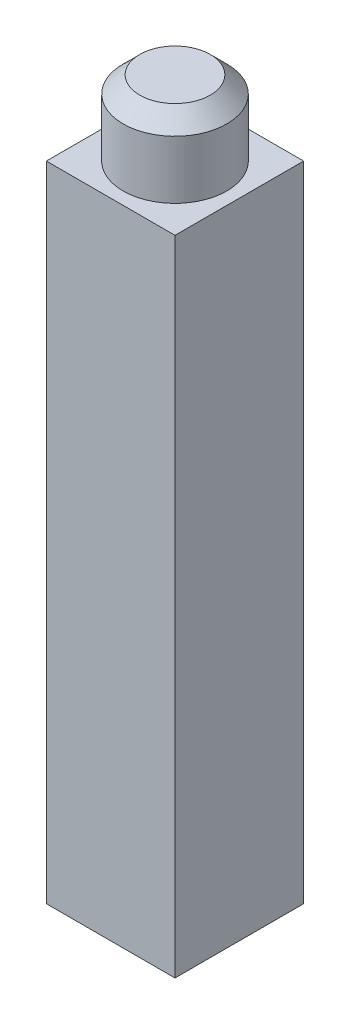
ISO-10303-21;
HEADER;
FILE_DESCRIPTION(('STEP AP214'),'2;1');
FILE_NAME('part.step','',(''),(''),'','','');
FILE_SCHEMA(('AUTOMOTIVE_DESIGN { 1 0 10303 214 1 1 1 1 }'));
ENDSEC;
DATA;
#1=APPLICATION_CONTEXT('core data for automotive mechanical design processes');
#2=APPLICATION_PROTOCOL_DEFINITION('international standard','automotive_design',2000,#1);
#3=PRODUCT_CONTEXT('',#1,'mechanical');
#4=PRODUCT('Part','Part','',(#3));
#5=PRODUCT_RELATED_PRODUCT_CATEGORY('part','',(#4));
#6=PRODUCT_DEFINITION_FORMATION('','',#4);
#7=PRODUCT_DEFINITION_CONTEXT('part definition',#1,'design');
#8=PRODUCT_DEFINITION('design','',#6,#7);
#9=PRODUCT_DEFINITION_SHAPE('','',#8);
#10=(LENGTH_UNIT() NAMED_UNIT(*) SI_UNIT(.MILLI.,.METRE.));
#11=(NAMED_UNIT(*) PLANE_ANGLE_UNIT() SI_UNIT($,.RADIAN.));
#12=(NAMED_UNIT(*) SI_UNIT($,.STERADIAN.) SOLID_ANGLE_UNIT());
#13=UNCERTAINTY_MEASURE_WITH_UNIT(LENGTH_MEASURE(1.E-05),#10,'distance_accuracy_value','');
#14=(GEOMETRIC_REPRESENTATION_CONTEXT(3) GLOBAL_UNCERTAINTY_ASSIGNED_CONTEXT((#13)) GLOBAL_UNIT_ASSIGNED_CONTEXT((#10,
#11,#12)) REPRESENTATION_CONTEXT('',''));
#15=CARTESIAN_POINT('',(0.,0.,0.));
#16=DIRECTION('',(0.,0.,1.));
#17=DIRECTION('',(1.,0.,0.));
#18=AXIS2_PLACEMENT_3D('',#15,#16,#17);
#19=CARTESIAN_POINT('',(1.95,4.3840620433566,1.95000000000002));
#20=DIRECTION('',(1.,0.,0.));
#21=DIRECTION('',(0.,0.,-1.));
#22=AXIS2_PLACEMENT_3D('',#19,#20,#21);
#23=PLANE('',#22);
#24=DIRECTION('',(0.,0.,1.));
#25=VECTOR('',#24,1.);
#26=CARTESIAN_POINT('',(1.95,-1.8,1.95000000000002));
#27=LINE('',#26,#25);
#28=CARTESIAN_POINT('',(1.95,-1.8,1.95000000000002));
#29=VERTEX_POINT('',#28);
#30=CARTESIAN_POINT('',(1.95,-1.8,5.05000000000002));
#31=VERTEX_POINT('',#30);
#32=EDGE_CURVE('E111',#29,#31,#27,.T.);
#33=ORIENTED_EDGE('',*,*,#32,.F.);
#34=DIRECTION('',(0.,-1.,0.));
#35=VECTOR('',#34,1.);
#36=CARTESIAN_POINT('',(1.95,4.3840620433566,1.95000000000002));
#37=LINE('',#36,#35);
#38=CARTESIAN_POINT('',(1.95,-17.3,1.95000000000002));
#39=VERTEX_POINT('',#38);
#40=EDGE_CURVE('E76',#29,#39,#37,.T.);
#41=ORIENTED_EDGE('',*,*,#40,.T.);
#42=DIRECTION('',(0.,0.,1.));
#43=VECTOR('',#42,1.);
#44=CARTESIAN_POINT('',(1.95,-17.3,1.95000000000002));
#45=LINE('',#44,#43);
#46=CARTESIAN_POINT('',(1.95,-17.3,5.05000000000002));
#47=VERTEX_POINT('',#46);
#48=EDGE_CURVE('E109',#39,#47,#45,.T.);
#49=ORIENTED_EDGE('',*,*,#48,.T.);
#50=DIRECTION('',(0.,-1.,0.));
#51=VECTOR('',#50,1.);
#52=CARTESIAN_POINT('',(1.95,4.3840620433566,5.05000000000002));
#53=LINE('',#52,#51);
#54=EDGE_CURVE('E99',#31,#47,#53,.T.);
#55=ORIENTED_EDGE('',*,*,#54,.F.);
#56=EDGE_LOOP('',(#33,#41,#49,#55));
#57=FACE_BOUND('',#56,.T.);
#58=ADVANCED_FACE('F61',(#57),#23,.F.);
#59=CARTESIAN_POINT('',(1.95,4.3840620433566,5.05000000000002));
#60=DIRECTION('',(0.,0.,-1.));
#61=DIRECTION('',(-1.,0.,0.));
#62=AXIS2_PLACEMENT_3D('',#59,#60,#61);
#63=PLANE('',#62);
#64=DIRECTION('',(1.,0.,0.));
#65=VECTOR('',#64,1.);
#66=CARTESIAN_POINT('',(1.95,-1.8,5.05000000000002));
#67=LINE('',#66,#65);
#68=CARTESIAN_POINT('',(5.05,-1.8,5.05000000000002));
#69=VERTEX_POINT('',#68);
#70=EDGE_CURVE('E105',#31,#69,#67,.T.);
#71=ORIENTED_EDGE('',*,*,#70,.F.);
#72=ORIENTED_EDGE('',*,*,#54,.T.);
#73=DIRECTION('',(1.,0.,0.));
#74=VECTOR('',#73,1.);
#75=CARTESIAN_POINT('',(1.95,-17.3,5.05000000000002));
#76=LINE('',#75,#74);
#77=CARTESIAN_POINT('',(5.05,-17.3,5.05000000000002));
#78=VERTEX_POINT('',#77);
#79=EDGE_CURVE('E122',#47,#78,#76,.T.);
#80=ORIENTED_EDGE('',*,*,#79,.T.);
#81=DIRECTION('',(0.,-1.,0.));
#82=VECTOR('',#81,1.);
#83=CARTESIAN_POINT('',(5.05,4.3840620433566,5.05000000000002));
#84=LINE('',#83,#82);
#85=EDGE_CURVE('E135',#69,#78,#84,.T.);
#86=ORIENTED_EDGE('',*,*,#85,.F.);
#87=EDGE_LOOP('',(#71,#72,#80,#86));
#88=FACE_BOUND('',#87,.T.);
#89=ADVANCED_FACE('F147',(#88),#63,.F.);
#90=CARTESIAN_POINT('',(5.05,4.3840620433566,1.95000000000002));
#91=DIRECTION('',(-1.,0.,0.));
#92=DIRECTION('',(0.,0.,1.));
#93=AXIS2_PLACEMENT_3D('',#90,#91,#92);
#94=PLANE('',#93);
#95=DIRECTION('',(0.,0.,-1.));
#96=VECTOR('',#95,1.);
#97=CARTESIAN_POINT('',(5.05,-1.8,1.95000000000002));
#98=LINE('',#97,#96);
#99=CARTESIAN_POINT('',(5.05,-1.8,1.95000000000002));
#100=VERTEX_POINT('',#99);
#101=EDGE_CURVE('E128',#69,#100,#98,.T.);
#102=ORIENTED_EDGE('',*,*,#101,.F.);
#103=ORIENTED_EDGE('',*,*,#85,.T.);
#104=DIRECTION('',(0.,0.,-1.));
#105=VECTOR('',#104,1.);
#106=CARTESIAN_POINT('',(5.05,-17.3,1.95000000000002));
#107=LINE('',#106,#105);
#108=CARTESIAN_POINT('',(5.05,-17.3,1.95000000000002));
#109=VERTEX_POINT('',#108);
#110=EDGE_CURVE('E137',#78,#109,#107,.T.);
#111=ORIENTED_EDGE('',*,*,#110,.T.);
#112=DIRECTION('',(0.,-1.,0.));
#113=VECTOR('',#112,1.);
#114=CARTESIAN_POINT('',(5.05,4.3840620433566,1.95000000000002));
#115=LINE('',#114,#113);
#116=EDGE_CURVE('E82',#100,#109,#115,.T.);
#117=ORIENTED_EDGE('',*,*,#116,.F.);
#118=EDGE_LOOP('',(#102,#103,#111,#117));
#119=FACE_BOUND('',#118,.T.);
#120=ADVANCED_FACE('F146',(#119),#94,.F.);
#121=CARTESIAN_POINT('',(1.95,4.3840620433566,1.95000000000002));
#122=DIRECTION('',(0.,0.,1.));
#123=DIRECTION('',(1.,0.,0.));
#124=AXIS2_PLACEMENT_3D('',#121,#122,#123);
#125=PLANE('',#124);
#126=DIRECTION('',(-1.,0.,0.));
#127=VECTOR('',#126,1.);
#128=CARTESIAN_POINT('',(1.95,-1.8,1.95000000000002));
#129=LINE('',#128,#127);
#130=EDGE_CURVE('E119',#100,#29,#129,.T.);
#131=ORIENTED_EDGE('',*,*,#130,.F.);
#132=ORIENTED_EDGE('',*,*,#116,.T.);
#133=DIRECTION('',(-1.,0.,0.));
#134=VECTOR('',#133,1.);
#135=CARTESIAN_POINT('',(1.95,-17.3,1.95000000000002));
#136=LINE('',#135,#134);
#137=EDGE_CURVE('E115',#109,#39,#136,.T.);
#138=ORIENTED_EDGE('',*,*,#137,.T.);
#139=ORIENTED_EDGE('',*,*,#40,.F.);
#140=EDGE_LOOP('',(#131,#132,#138,#139));
#141=FACE_BOUND('',#140,.T.);
#142=ADVANCED_FACE('F116',(#141),#125,.F.);
#143=CARTESIAN_POINT('',(0.,-17.3,0.));
#144=DIRECTION('',(0.,1.,0.));
#145=DIRECTION('',(0.,0.,1.));
#146=AXIS2_PLACEMENT_3D('',#143,#144,#145);
#147=PLANE('',#146);
#148=ORIENTED_EDGE('',*,*,#48,.F.);
#149=ORIENTED_EDGE('',*,*,#137,.F.);
#150=ORIENTED_EDGE('',*,*,#110,.F.);
#151=ORIENTED_EDGE('',*,*,#79,.F.);
#152=EDGE_LOOP('',(#148,#149,#150,#151));
#153=FACE_BOUND('',#152,.T.);
#154=ADVANCED_FACE('F121',(#153),#147,.F.);
#155=CARTESIAN_POINT('',(0.,-1.8,0.));
#156=DIRECTION('',(0.,1.,0.));
#157=DIRECTION('',(0.,0.,1.));
#158=AXIS2_PLACEMENT_3D('',#155,#156,#157);
#159=PLANE('',#158);
#160=CARTESIAN_POINT('',(3.5,-1.8,3.50000000000002));
#161=DIRECTION('',(0.,1.,0.));
#162=DIRECTION('',(0.,0.,1.));
#163=AXIS2_PLACEMENT_3D('',#160,#161,#162);
#164=CIRCLE('',#163,1.25);
#165=CARTESIAN_POINT('',(3.5,-1.8,4.75000000000002));
#166=VERTEX_POINT('',#165);
#167=EDGE_CURVE('E131',#166,#166,#164,.T.);
#168=ORIENTED_EDGE('',*,*,#167,.F.);
#169=EDGE_LOOP('',(#168));
#170=FACE_BOUND('',#169,.T.);
#171=ORIENTED_EDGE('',*,*,#130,.T.);
#172=ORIENTED_EDGE('',*,*,#32,.T.);
#173=ORIENTED_EDGE('',*,*,#70,.T.);
#174=ORIENTED_EDGE('',*,*,#101,.T.);
#175=EDGE_LOOP('',(#171,#172,#173,#174));
#176=FACE_BOUND('',#175,.T.);
#177=ADVANCED_FACE('F157',(#170,#176),#159,.T.);
#178=CARTESIAN_POINT('',(3.5,0.,3.50000000000002));
#179=DIRECTION('',(0.,-1.,0.));
#180=DIRECTION('',(0.,0.,-1.));
#181=AXIS2_PLACEMENT_3D('',#178,#179,#180);
#182=CYLINDRICAL_SURFACE('',#181,1.25);
#183=CARTESIAN_POINT('',(3.5,-0.400000000000001,3.50000000000002));
#184=DIRECTION('',(0.,1.,0.));
#185=DIRECTION('',(0.,0.,1.));
#186=AXIS2_PLACEMENT_3D('',#183,#184,#185);
#187=CIRCLE('',#186,1.25);
#188=CARTESIAN_POINT('',(3.5,-0.400000000000001,4.75000000000002));
#189=VERTEX_POINT('',#188);
#190=EDGE_CURVE('E13',#189,#189,#187,.F.);
#191=ORIENTED_EDGE('',*,*,#190,.T.);
#192=EDGE_LOOP('',(#191));
#193=FACE_BOUND('',#192,.T.);
#194=ORIENTED_EDGE('',*,*,#167,.T.);
#195=EDGE_LOOP('',(#194));
#196=FACE_BOUND('',#195,.T.);
#197=ADVANCED_FACE('F159',(#193,#196),#182,.T.);
#198=CARTESIAN_POINT('',(3.5,0.,3.50000000000002));
#199=DIRECTION('',(0.,1.,0.));
#200=DIRECTION('',(0.,0.,1.));
#201=AXIS2_PLACEMENT_3D('',#198,#199,#200);
#202=PLANE('',#201);
#203=CARTESIAN_POINT('',(3.5,0.,3.50000000000002));
#204=DIRECTION('',(0.,1.,0.));
#205=DIRECTION('',(0.,0.,1.));
#206=AXIS2_PLACEMENT_3D('',#203,#204,#205);
#207=CIRCLE('',#206,0.850000000000002);
#208=CARTESIAN_POINT('',(3.5,0.,4.35000000000003));
#209=VERTEX_POINT('',#208);
#210=EDGE_CURVE('E69',#209,#209,#207,.T.);
#211=ORIENTED_EDGE('',*,*,#210,.T.);
#212=EDGE_LOOP('',(#211));
#213=FACE_BOUND('',#212,.T.);
#214=ADVANCED_FACE('F165',(#213),#202,.T.);
#215=CARTESIAN_POINT('',(3.5,0.,3.50000000000002));
#216=DIRECTION('',(0.,-1.,0.));
#217=DIRECTION('',(0.,0.,-1.));
#218=AXIS2_PLACEMENT_3D('',#215,#216,#217);
#219=CONICAL_SURFACE('',#218,0.850000000000002,0.785398163397446);
#220=ORIENTED_EDGE('',*,*,#190,.F.);
#221=EDGE_LOOP('',(#220));
#222=FACE_BOUND('',#221,.T.);
#223=ORIENTED_EDGE('',*,*,#210,.F.);
#224=EDGE_LOOP('',(#223));
#225=FACE_BOUND('',#224,.T.);
#226=ADVANCED_FACE('F63',(#222,#225),#219,.T.);
#227=CLOSED_SHELL('',(#58,#89,#120,#142,#154,#177,#197,#214,#226));
#228=MANIFOLD_SOLID_BREP('B2',#227);
#229=ADVANCED_BREP_SHAPE_REPRESENTATION('',(#18,#228),#14);
#230=SHAPE_DEFINITION_REPRESENTATION(#9,#229);
ENDSEC;
END-ISO-10303-21;
